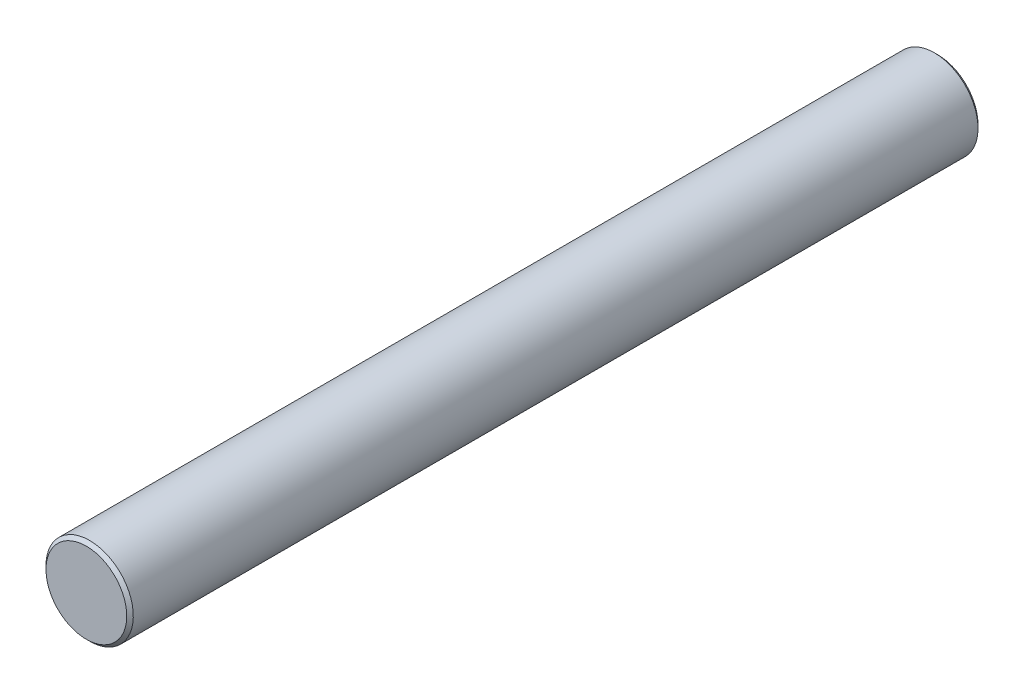
ISO-10303-21;
HEADER;
FILE_DESCRIPTION(('STEP AP214'),'2;1');
FILE_NAME('part.step','',(''),(''),'','','');
FILE_SCHEMA(('AUTOMOTIVE_DESIGN { 1 0 10303 214 1 1 1 1 }'));
ENDSEC;
DATA;
#1=APPLICATION_CONTEXT('core data for automotive mechanical design processes');
#2=APPLICATION_PROTOCOL_DEFINITION('international standard','automotive_design',2000,#1);
#3=PRODUCT_CONTEXT('',#1,'mechanical');
#4=PRODUCT('Part','Part','',(#3));
#5=PRODUCT_RELATED_PRODUCT_CATEGORY('part','',(#4));
#6=PRODUCT_DEFINITION_FORMATION('','',#4);
#7=PRODUCT_DEFINITION_CONTEXT('part definition',#1,'design');
#8=PRODUCT_DEFINITION('design','',#6,#7);
#9=PRODUCT_DEFINITION_SHAPE('','',#8);
#10=(LENGTH_UNIT() NAMED_UNIT(*) SI_UNIT(.MILLI.,.METRE.));
#11=(NAMED_UNIT(*) PLANE_ANGLE_UNIT() SI_UNIT($,.RADIAN.));
#12=(NAMED_UNIT(*) SI_UNIT($,.STERADIAN.) SOLID_ANGLE_UNIT());
#13=UNCERTAINTY_MEASURE_WITH_UNIT(LENGTH_MEASURE(1.E-05),#10,'distance_accuracy_value','');
#14=(GEOMETRIC_REPRESENTATION_CONTEXT(3) GLOBAL_UNCERTAINTY_ASSIGNED_CONTEXT((#13)) GLOBAL_UNIT_ASSIGNED_CONTEXT((#10,
#11,#12)) REPRESENTATION_CONTEXT('',''));
#15=CARTESIAN_POINT('',(0.,0.,0.));
#16=DIRECTION('',(0.,0.,1.));
#17=DIRECTION('',(1.,0.,0.));
#18=AXIS2_PLACEMENT_3D('',#15,#16,#17);
#19=CARTESIAN_POINT('',(0.,9.25,0.));
#20=DIRECTION('',(0.,0.,-1.));
#21=DIRECTION('',(0.,1.,0.));
#22=AXIS2_PLACEMENT_3D('',#19,#20,#21);
#23=PLANE('',#22);
#24=CARTESIAN_POINT('',(0.,0.,0.));
#25=DIRECTION('',(0.,0.,-1.));
#26=DIRECTION('',(0.,1.,0.));
#27=AXIS2_PLACEMENT_3D('',#24,#25,#26);
#28=CIRCLE('',#27,18.5);
#29=CARTESIAN_POINT('',(0.,18.5,0.));
#30=VERTEX_POINT('',#29);
#31=EDGE_CURVE('E9',#30,#30,#28,.T.);
#32=ORIENTED_EDGE('',*,*,#31,.T.);
#33=EDGE_LOOP('',(#32));
#34=FACE_BOUND('',#33,.T.);
#35=CARTESIAN_POINT('',(0.,0.,0.));
#36=DIRECTION('',(0.,0.,1.));
#37=DIRECTION('',(-1.,0.,0.));
#38=AXIS2_PLACEMENT_3D('',#35,#36,#37);
#39=CIRCLE('',#38,6.);
#40=CARTESIAN_POINT('',(-6.,0.,0.));
#41=VERTEX_POINT('',#40);
#42=EDGE_CURVE('E49',#41,#41,#39,.T.);
#43=ORIENTED_EDGE('',*,*,#42,.T.);
#44=EDGE_LOOP('',(#43));
#45=FACE_BOUND('',#44,.T.);
#46=ADVANCED_FACE('F15',(#34,#45),#23,.T.);
#47=CARTESIAN_POINT('',(0.,0.,0.75));
#48=DIRECTION('',(0.,0.,1.));
#49=DIRECTION('',(0.,1.,0.));
#50=AXIS2_PLACEMENT_3D('',#47,#48,#49);
#51=CONICAL_SURFACE('',#50,19.25,0.785398163397448);
#52=CARTESIAN_POINT('',(0.,0.,1.5));
#53=DIRECTION('',(0.,0.,-1.));
#54=DIRECTION('',(0.,1.,0.));
#55=AXIS2_PLACEMENT_3D('',#52,#53,#54);
#56=CIRCLE('',#55,20.);
#57=CARTESIAN_POINT('',(0.,20.,1.5));
#58=VERTEX_POINT('',#57);
#59=EDGE_CURVE('E23',#58,#58,#56,.T.);
#60=ORIENTED_EDGE('',*,*,#59,.T.);
#61=EDGE_LOOP('',(#60));
#62=FACE_BOUND('',#61,.T.);
#63=ORIENTED_EDGE('',*,*,#31,.F.);
#64=EDGE_LOOP('',(#63));
#65=FACE_BOUND('',#64,.T.);
#66=ADVANCED_FACE('F113',(#62,#65),#51,.T.);
#67=CARTESIAN_POINT('',(0.,0.,195.));
#68=DIRECTION('',(0.,0.,1.));
#69=DIRECTION('',(0.,1.,0.));
#70=AXIS2_PLACEMENT_3D('',#67,#68,#69);
#71=CYLINDRICAL_SURFACE('',#70,20.);
#72=CARTESIAN_POINT('',(0.,0.,388.5));
#73=DIRECTION('',(0.,0.,-1.));
#74=DIRECTION('',(0.,1.,0.));
#75=AXIS2_PLACEMENT_3D('',#72,#73,#74);
#76=CIRCLE('',#75,20.);
#77=CARTESIAN_POINT('',(0.,20.,388.5));
#78=VERTEX_POINT('',#77);
#79=EDGE_CURVE('E97',#78,#78,#76,.T.);
#80=ORIENTED_EDGE('',*,*,#79,.T.);
#81=EDGE_LOOP('',(#80));
#82=FACE_BOUND('',#81,.T.);
#83=ORIENTED_EDGE('',*,*,#59,.F.);
#84=EDGE_LOOP('',(#83));
#85=FACE_BOUND('',#84,.T.);
#86=CARTESIAN_POINT('',(0.,0.,6.5));
#87=DIRECTION('',(0.,0.,-1.));
#88=DIRECTION('',(0.,1.,0.));
#89=AXIS2_PLACEMENT_3D('',#86,#87,#88);
#90=CIRCLE('',#89,20.);
#91=CARTESIAN_POINT('',(10.5356537528527,-17.,6.5));
#92=VERTEX_POINT('',#91);
#93=CARTESIAN_POINT('',(-10.5356537528527,-17.,6.5));
#94=VERTEX_POINT('',#93);
#95=EDGE_CURVE('E84',#92,#94,#90,.T.);
#96=ORIENTED_EDGE('',*,*,#95,.T.);
#97=DIRECTION('',(0.,0.,1.));
#98=VECTOR('',#97,1.);
#99=CARTESIAN_POINT('',(-10.5356537528527,-17.,8.25));
#100=LINE('',#99,#98);
#101=CARTESIAN_POINT('',(-10.5356537528527,-17.,10.));
#102=VERTEX_POINT('',#101);
#103=EDGE_CURVE('E69',#94,#102,#100,.T.);
#104=ORIENTED_EDGE('',*,*,#103,.T.);
#105=CARTESIAN_POINT('',(0.,0.,10.));
#106=DIRECTION('',(0.,0.,1.));
#107=DIRECTION('',(0.,1.,0.));
#108=AXIS2_PLACEMENT_3D('',#105,#106,#107);
#109=CIRCLE('',#108,20.);
#110=CARTESIAN_POINT('',(10.5356537528527,-17.,10.));
#111=VERTEX_POINT('',#110);
#112=EDGE_CURVE('E88',#102,#111,#109,.T.);
#113=ORIENTED_EDGE('',*,*,#112,.T.);
#114=DIRECTION('',(0.,0.,-1.));
#115=VECTOR('',#114,1.);
#116=CARTESIAN_POINT('',(10.5356537528527,-17.,8.25));
#117=LINE('',#116,#115);
#118=EDGE_CURVE('E80',#111,#92,#117,.T.);
#119=ORIENTED_EDGE('',*,*,#118,.T.);
#120=EDGE_LOOP('',(#96,#104,#113,#119));
#121=FACE_BOUND('',#120,.T.);
#122=ADVANCED_FACE('F86',(#82,#85,#121),#71,.T.);
#123=CARTESIAN_POINT('',(0.,0.,389.25));
#124=DIRECTION('',(0.,0.,-1.));
#125=DIRECTION('',(0.,1.,0.));
#126=AXIS2_PLACEMENT_3D('',#123,#124,#125);
#127=CONICAL_SURFACE('',#126,19.25,0.785398163397448);
#128=CARTESIAN_POINT('',(0.,0.,390.));
#129=DIRECTION('',(0.,0.,-1.));
#130=DIRECTION('',(0.,1.,0.));
#131=AXIS2_PLACEMENT_3D('',#128,#129,#130);
#132=CIRCLE('',#131,18.5);
#133=CARTESIAN_POINT('',(0.,18.5,390.));
#134=VERTEX_POINT('',#133);
#135=EDGE_CURVE('E37',#134,#134,#132,.T.);
#136=ORIENTED_EDGE('',*,*,#135,.T.);
#137=EDGE_LOOP('',(#136));
#138=FACE_BOUND('',#137,.T.);
#139=ORIENTED_EDGE('',*,*,#79,.F.);
#140=EDGE_LOOP('',(#139));
#141=FACE_BOUND('',#140,.T.);
#142=ADVANCED_FACE('F121',(#138,#141),#127,.T.);
#143=CARTESIAN_POINT('',(0.,9.25,390.));
#144=DIRECTION('',(0.,0.,1.));
#145=DIRECTION('',(0.,-1.,0.));
#146=AXIS2_PLACEMENT_3D('',#143,#144,#145);
#147=PLANE('',#146);
#148=ORIENTED_EDGE('',*,*,#135,.F.);
#149=EDGE_LOOP('',(#148));
#150=FACE_BOUND('',#149,.T.);
#151=ADVANCED_FACE('F136',(#150),#147,.T.);
#152=CARTESIAN_POINT('',(0.,0.,26.4586213285198));
#153=DIRECTION('',(0.,0.,-1.));
#154=DIRECTION('',(-1.,0.,0.));
#155=AXIS2_PLACEMENT_3D('',#152,#153,#154);
#156=CONICAL_SURFACE('',#155,2.52640625,1.0471975511966);
#157=CARTESIAN_POINT('',(0.,0.,25.));
#158=DIRECTION('',(0.,0.,1.));
#159=DIRECTION('',(-1.,0.,0.));
#160=AXIS2_PLACEMENT_3D('',#157,#158,#159);
#161=CIRCLE('',#160,5.0528125);
#162=CARTESIAN_POINT('',(-5.0528125,0.,25.));
#163=VERTEX_POINT('',#162);
#164=EDGE_CURVE('E43',#163,#163,#161,.T.);
#165=ORIENTED_EDGE('',*,*,#164,.F.);
#166=EDGE_LOOP('',(#165));
#167=FACE_BOUND('',#166,.T.);
#168=CARTESIAN_POINT('',(0.,0.,27.9172426570397));
#169=VERTEX_POINT('',#168);
#170=VERTEX_LOOP('',#169);
#171=FACE_BOUND('',#170,.T.);
#172=ADVANCED_FACE('F132',(#167,#171),#156,.F.);
#173=CARTESIAN_POINT('',(0.,0.,12.97359375));
#174=DIRECTION('',(0.,0.,-1.));
#175=DIRECTION('',(-1.,0.,0.));
#176=AXIS2_PLACEMENT_3D('',#173,#174,#175);
#177=CYLINDRICAL_SURFACE('',#176,5.0528125);
#178=CARTESIAN_POINT('',(0.,0.,0.9471875));
#179=DIRECTION('',(0.,0.,1.));
#180=DIRECTION('',(-1.,0.,0.));
#181=AXIS2_PLACEMENT_3D('',#178,#179,#180);
#182=CIRCLE('',#181,5.0528125);
#183=CARTESIAN_POINT('',(-5.0528125,0.,0.9471875));
#184=VERTEX_POINT('',#183);
#185=EDGE_CURVE('E94',#184,#184,#182,.T.);
#186=ORIENTED_EDGE('',*,*,#185,.F.);
#187=EDGE_LOOP('',(#186));
#188=FACE_BOUND('',#187,.T.);
#189=ORIENTED_EDGE('',*,*,#164,.T.);
#190=EDGE_LOOP('',(#189));
#191=FACE_BOUND('',#190,.T.);
#192=ADVANCED_FACE('F128',(#188,#191),#177,.F.);
#193=CARTESIAN_POINT('',(0.,0.,0.47359375));
#194=DIRECTION('',(0.,0.,-1.));
#195=DIRECTION('',(-1.,0.,0.));
#196=AXIS2_PLACEMENT_3D('',#193,#194,#195);
#197=CONICAL_SURFACE('',#196,5.52640625,0.785398163397448);
#198=ORIENTED_EDGE('',*,*,#42,.F.);
#199=EDGE_LOOP('',(#198));
#200=FACE_BOUND('',#199,.T.);
#201=ORIENTED_EDGE('',*,*,#185,.T.);
#202=EDGE_LOOP('',(#201));
#203=FACE_BOUND('',#202,.T.);
#204=ADVANCED_FACE('F125',(#200,#203),#197,.F.);
#205=CARTESIAN_POINT('',(0.,-17.,8.25));
#206=DIRECTION('',(0.,-1.,0.));
#207=DIRECTION('',(0.,0.,-1.));
#208=AXIS2_PLACEMENT_3D('',#205,#206,#207);
#209=PLANE('',#208);
#210=ORIENTED_EDGE('',*,*,#103,.F.);
#211=DIRECTION('',(1.,0.,0.));
#212=VECTOR('',#211,1.);
#213=CARTESIAN_POINT('',(0.,-17.,6.5));
#214=LINE('',#213,#212);
#215=EDGE_CURVE('E72',#94,#92,#214,.T.);
#216=ORIENTED_EDGE('',*,*,#215,.T.);
#217=ORIENTED_EDGE('',*,*,#118,.F.);
#218=DIRECTION('',(-1.,0.,0.));
#219=VECTOR('',#218,1.);
#220=CARTESIAN_POINT('',(0.,-17.,10.));
#221=LINE('',#220,#219);
#222=EDGE_CURVE('E75',#111,#102,#221,.T.);
#223=ORIENTED_EDGE('',*,*,#222,.T.);
#224=EDGE_LOOP('',(#210,#216,#217,#223));
#225=FACE_BOUND('',#224,.T.);
#226=ADVANCED_FACE('F71',(#225),#209,.T.);
#227=CARTESIAN_POINT('',(0.,-19.5,6.5));
#228=DIRECTION('',(0.,0.,1.));
#229=DIRECTION('',(1.,0.,0.));
#230=AXIS2_PLACEMENT_3D('',#227,#228,#229);
#231=PLANE('',#230);
#232=ORIENTED_EDGE('',*,*,#95,.F.);
#233=ORIENTED_EDGE('',*,*,#215,.F.);
#234=EDGE_LOOP('',(#232,#233));
#235=FACE_BOUND('',#234,.T.);
#236=ADVANCED_FACE('F83',(#235),#231,.T.);
#237=CARTESIAN_POINT('',(0.,-19.5,10.));
#238=DIRECTION('',(0.,0.,1.));
#239=DIRECTION('',(1.,0.,0.));
#240=AXIS2_PLACEMENT_3D('',#237,#238,#239);
#241=PLANE('',#240);
#242=ORIENTED_EDGE('',*,*,#112,.F.);
#243=ORIENTED_EDGE('',*,*,#222,.F.);
#244=EDGE_LOOP('',(#242,#243));
#245=FACE_BOUND('',#244,.T.);
#246=ADVANCED_FACE('F104',(#245),#241,.F.);
#247=CLOSED_SHELL('',(#46,#66,#122,#142,#151,#172,#192,#204,#226,#236,#246));
#248=MANIFOLD_SOLID_BREP('B1',#247);
#249=ADVANCED_BREP_SHAPE_REPRESENTATION('',(#18,#248),#14);
#250=SHAPE_DEFINITION_REPRESENTATION(#9,#249);
ENDSEC;
END-ISO-10303-21;
